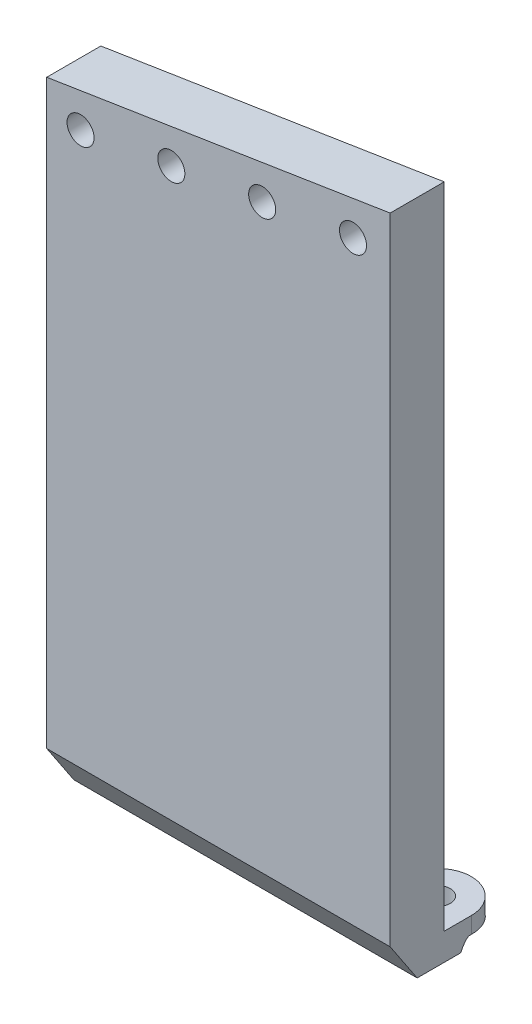
ISO-10303-21;
HEADER;
FILE_DESCRIPTION(('STEP AP214'),'2;1');
FILE_NAME('part.step','',(''),(''),'','','');
FILE_SCHEMA(('AUTOMOTIVE_DESIGN { 1 0 10303 214 1 1 1 1 }'));
ENDSEC;
DATA;
#1=APPLICATION_CONTEXT('core data for automotive mechanical design processes');
#2=APPLICATION_PROTOCOL_DEFINITION('international standard','automotive_design',2000,#1);
#3=PRODUCT_CONTEXT('',#1,'mechanical');
#4=PRODUCT('Part','Part','',(#3));
#5=PRODUCT_RELATED_PRODUCT_CATEGORY('part','',(#4));
#6=PRODUCT_DEFINITION_FORMATION('','',#4);
#7=PRODUCT_DEFINITION_CONTEXT('part definition',#1,'design');
#8=PRODUCT_DEFINITION('design','',#6,#7);
#9=PRODUCT_DEFINITION_SHAPE('','',#8);
#10=(LENGTH_UNIT() NAMED_UNIT(*) SI_UNIT(.MILLI.,.METRE.));
#11=(NAMED_UNIT(*) PLANE_ANGLE_UNIT() SI_UNIT($,.RADIAN.));
#12=(NAMED_UNIT(*) SI_UNIT($,.STERADIAN.) SOLID_ANGLE_UNIT());
#13=UNCERTAINTY_MEASURE_WITH_UNIT(LENGTH_MEASURE(1.E-05),#10,'distance_accuracy_value','');
#14=(GEOMETRIC_REPRESENTATION_CONTEXT(3) GLOBAL_UNCERTAINTY_ASSIGNED_CONTEXT((#13)) GLOBAL_UNIT_ASSIGNED_CONTEXT((#10,
#11,#12)) REPRESENTATION_CONTEXT('',''));
#15=CARTESIAN_POINT('',(0.,0.,0.));
#16=DIRECTION('',(0.,0.,1.));
#17=DIRECTION('',(1.,0.,0.));
#18=AXIS2_PLACEMENT_3D('',#15,#16,#17);
#19=CARTESIAN_POINT('',(3.175,2.54,-7.62));
#20=DIRECTION('',(0.,-1.,0.));
#21=DIRECTION('',(0.,0.,-1.));
#22=AXIS2_PLACEMENT_3D('',#19,#20,#21);
#23=PLANE('',#22);
#24=DIRECTION('',(-1.,0.,0.));
#25=VECTOR('',#24,1.);
#26=CARTESIAN_POINT('',(0.,2.54,-5.08));
#27=LINE('',#26,#25);
#28=CARTESIAN_POINT('',(32.258,2.54,-5.08));
#29=VERTEX_POINT('',#28);
#30=CARTESIAN_POINT('',(0.,2.54,-5.08));
#31=VERTEX_POINT('',#30);
#32=EDGE_CURVE('E11',#29,#31,#27,.T.);
#33=ORIENTED_EDGE('',*,*,#32,.F.);
#34=DIRECTION('',(0.,0.,-1.));
#35=VECTOR('',#34,1.);
#36=CARTESIAN_POINT('',(32.258,2.54,-7.62));
#37=LINE('',#36,#35);
#38=CARTESIAN_POINT('',(32.258,2.54,-7.62));
#39=VERTEX_POINT('',#38);
#40=EDGE_CURVE('E161',#29,#39,#37,.T.);
#41=ORIENTED_EDGE('',*,*,#40,.T.);
#42=CARTESIAN_POINT('',(29.083,2.54,-7.62));
#43=DIRECTION('',(0.,1.,0.));
#44=DIRECTION('',(0.,0.,1.));
#45=AXIS2_PLACEMENT_3D('',#42,#43,#44);
#46=CIRCLE('',#45,3.175);
#47=CARTESIAN_POINT('',(25.908,2.54,-7.62));
#48=VERTEX_POINT('',#47);
#49=EDGE_CURVE('E183',#39,#48,#46,.T.);
#50=ORIENTED_EDGE('',*,*,#49,.T.);
#51=DIRECTION('',(-1.,0.,0.));
#52=VECTOR('',#51,1.);
#53=CARTESIAN_POINT('',(6.35,2.54,-7.62));
#54=LINE('',#53,#52);
#55=CARTESIAN_POINT('',(6.35,2.54,-7.62));
#56=VERTEX_POINT('',#55);
#57=EDGE_CURVE('E578',#48,#56,#54,.T.);
#58=ORIENTED_EDGE('',*,*,#57,.T.);
#59=CARTESIAN_POINT('',(3.175,2.54,-7.62));
#60=DIRECTION('',(0.,1.,0.));
#61=DIRECTION('',(0.,0.,-1.));
#62=AXIS2_PLACEMENT_3D('',#59,#60,#61);
#63=CIRCLE('',#62,3.175);
#64=CARTESIAN_POINT('',(0.,2.54,-7.62));
#65=VERTEX_POINT('',#64);
#66=EDGE_CURVE('E579',#56,#65,#63,.T.);
#67=ORIENTED_EDGE('',*,*,#66,.T.);
#68=DIRECTION('',(0.,0.,1.));
#69=VECTOR('',#68,1.);
#70=CARTESIAN_POINT('',(0.,2.54,0.));
#71=LINE('',#70,#69);
#72=EDGE_CURVE('E186',#65,#31,#71,.T.);
#73=ORIENTED_EDGE('',*,*,#72,.T.);
#74=EDGE_LOOP('',(#33,#41,#50,#58,#67,#73));
#75=FACE_BOUND('',#74,.T.);
#76=CARTESIAN_POINT('',(29.083,2.54,-7.62));
#77=DIRECTION('',(0.,1.,0.));
#78=DIRECTION('',(0.,0.,1.));
#79=AXIS2_PLACEMENT_3D('',#76,#77,#78);
#80=CIRCLE('',#79,1.2065);
#81=CARTESIAN_POINT('',(29.083,2.54,-6.4135));
#82=VERTEX_POINT('',#81);
#83=EDGE_CURVE('E174',#82,#82,#80,.T.);
#84=ORIENTED_EDGE('',*,*,#83,.F.);
#85=EDGE_LOOP('',(#84));
#86=FACE_BOUND('',#85,.T.);
#87=CARTESIAN_POINT('',(3.175,2.54,-7.62));
#88=DIRECTION('',(0.,1.,0.));
#89=DIRECTION('',(0.,0.,1.));
#90=AXIS2_PLACEMENT_3D('',#87,#88,#89);
#91=CIRCLE('',#90,1.2065);
#92=CARTESIAN_POINT('',(3.175,2.54,-6.4135));
#93=VERTEX_POINT('',#92);
#94=EDGE_CURVE('E177',#93,#93,#91,.T.);
#95=ORIENTED_EDGE('',*,*,#94,.F.);
#96=EDGE_LOOP('',(#95));
#97=FACE_BOUND('',#96,.T.);
#98=ADVANCED_FACE('F32',(#75,#86,#97),#23,.F.);
#99=CARTESIAN_POINT('',(3.175,0.,-7.62));
#100=DIRECTION('',(0.,-1.,0.));
#101=DIRECTION('',(0.,0.,-1.));
#102=AXIS2_PLACEMENT_3D('',#99,#100,#101);
#103=PLANE('',#102);
#104=DIRECTION('',(0.,0.,-1.));
#105=VECTOR('',#104,1.);
#106=CARTESIAN_POINT('',(32.258,0.,-7.62));
#107=LINE('',#106,#105);
#108=CARTESIAN_POINT('',(32.258,0.,-2.54));
#109=VERTEX_POINT('',#108);
#110=CARTESIAN_POINT('',(32.258,0.,-6.6275294111197));
#111=VERTEX_POINT('',#110);
#112=EDGE_CURVE('E567',#109,#111,#107,.T.);
#113=ORIENTED_EDGE('',*,*,#112,.F.);
#114=DIRECTION('',(-1.,0.,0.));
#115=VECTOR('',#114,1.);
#116=CARTESIAN_POINT('',(36.8370501198393,0.,-2.54));
#117=LINE('',#116,#115);
#118=CARTESIAN_POINT('',(0.,0.,-2.54));
#119=VERTEX_POINT('',#118);
#120=EDGE_CURVE('E40',#109,#119,#117,.T.);
#121=ORIENTED_EDGE('',*,*,#120,.T.);
#122=DIRECTION('',(0.,0.,1.));
#123=VECTOR('',#122,1.);
#124=CARTESIAN_POINT('',(0.,0.,0.));
#125=LINE('',#124,#123);
#126=CARTESIAN_POINT('',(0.,0.,-7.61183733119424));
#127=VERTEX_POINT('',#126);
#128=EDGE_CURVE('E180',#127,#119,#125,.T.);
#129=ORIENTED_EDGE('',*,*,#128,.F.);
#130=CARTESIAN_POINT('',(3.25567860446436,0.,-7.61591866559716));
#131=DIRECTION('',(0.,-1.,0.));
#132=DIRECTION('',(-1.,0.,0.));
#133=AXIS2_PLACEMENT_3D('',#130,#131,#132);
#134=ELLIPSE('',#133,3.25568122609679,3.21604640238336);
#135=CARTESIAN_POINT('',(6.51135720892872,0.,-7.62));
#136=VERTEX_POINT('',#135);
#137=EDGE_CURVE('E311',#136,#127,#134,.T.);
#138=ORIENTED_EDGE('',*,*,#137,.F.);
#139=DIRECTION('',(-1.,0.,0.));
#140=VECTOR('',#139,1.);
#141=CARTESIAN_POINT('',(6.35,0.,-7.62));
#142=LINE('',#141,#140);
#143=CARTESIAN_POINT('',(25.908,0.,-7.62));
#144=VERTEX_POINT('',#143);
#145=EDGE_CURVE('E298',#144,#136,#142,.T.);
#146=ORIENTED_EDGE('',*,*,#145,.F.);
#147=CARTESIAN_POINT('',(29.1669458751256,0.,-7.64786729186757));
#148=DIRECTION('',(0.,-1.,0.));
#149=DIRECTION('',(-1.,0.,0.));
#150=AXIS2_PLACEMENT_3D('',#147,#148,#149);
#151=ELLIPSE('',#150,3.25906797448663,3.21939192033137);
#152=EDGE_CURVE('E327',#111,#144,#151,.T.);
#153=ORIENTED_EDGE('',*,*,#152,.F.);
#154=EDGE_LOOP('',(#113,#121,#129,#138,#146,#153));
#155=FACE_BOUND('',#154,.T.);
#156=ADVANCED_FACE('F276',(#155),#103,.T.);
#157=CARTESIAN_POINT('',(0.,2.54,0.));
#158=DIRECTION('',(0.,0.,-1.));
#159=DIRECTION('',(-1.,0.,0.));
#160=AXIS2_PLACEMENT_3D('',#157,#158,#159);
#161=PLANE('',#160);
#162=DIRECTION('',(-1.,0.,0.));
#163=VECTOR('',#162,1.);
#164=CARTESIAN_POINT('',(36.8370501198393,3.81,0.));
#165=LINE('',#164,#163);
#166=CARTESIAN_POINT('',(32.258,3.81,0.));
#167=VERTEX_POINT('',#166);
#168=CARTESIAN_POINT('',(0.,3.81,0.));
#169=VERTEX_POINT('',#168);
#170=EDGE_CURVE('E160',#167,#169,#165,.T.);
#171=ORIENTED_EDGE('',*,*,#170,.F.);
#172=DIRECTION('',(0.,1.,0.));
#173=VECTOR('',#172,1.);
#174=CARTESIAN_POINT('',(32.258,63.5,0.));
#175=LINE('',#174,#173);
#176=CARTESIAN_POINT('',(32.258,63.5,0.));
#177=VERTEX_POINT('',#176);
#178=EDGE_CURVE('E144',#167,#177,#175,.T.);
#179=ORIENTED_EDGE('',*,*,#178,.T.);
#180=DIRECTION('',(0.987825950711718,0.155563141844365,0.));
#181=VECTOR('',#180,1.);
#182=CARTESIAN_POINT('',(32.258,63.5,0.));
#183=LINE('',#182,#181);
#184=CARTESIAN_POINT('',(0.,58.42,0.));
#185=VERTEX_POINT('',#184);
#186=EDGE_CURVE('E159',#185,#177,#183,.T.);
#187=ORIENTED_EDGE('',*,*,#186,.F.);
#188=DIRECTION('',(0.,-1.,0.));
#189=VECTOR('',#188,1.);
#190=CARTESIAN_POINT('',(0.,2.54,0.));
#191=LINE('',#190,#189);
#192=EDGE_CURVE('E191',#185,#169,#191,.T.);
#193=ORIENTED_EDGE('',*,*,#192,.T.);
#194=EDGE_LOOP('',(#171,#179,#187,#193));
#195=FACE_BOUND('',#194,.T.);
#196=CARTESIAN_POINT('',(3.175,55.7058710355681,0.));
#197=DIRECTION('',(0.,0.,-1.));
#198=DIRECTION('',(-1.,0.,0.));
#199=AXIS2_PLACEMENT_3D('',#196,#197,#198);
#200=CIRCLE('',#199,1.27);
#201=CARTESIAN_POINT('',(1.905,55.7058710355681,0.));
#202=VERTEX_POINT('',#201);
#203=EDGE_CURVE('E336',#202,#202,#200,.F.);
#204=ORIENTED_EDGE('',*,*,#203,.F.);
#205=EDGE_LOOP('',(#204));
#206=FACE_BOUND('',#205,.T.);
#207=CARTESIAN_POINT('',(11.7058649103464,57.049314328536,0.));
#208=DIRECTION('',(0.,0.,-1.));
#209=DIRECTION('',(-1.,0.,0.));
#210=AXIS2_PLACEMENT_3D('',#207,#208,#209);
#211=CIRCLE('',#210,1.27);
#212=CARTESIAN_POINT('',(10.4358649103464,57.049314328536,0.));
#213=VERTEX_POINT('',#212);
#214=EDGE_CURVE('E342',#213,#213,#211,.F.);
#215=ORIENTED_EDGE('',*,*,#214,.F.);
#216=EDGE_LOOP('',(#215));
#217=FACE_BOUND('',#216,.T.);
#218=CARTESIAN_POINT('',(20.2367298206928,58.392757621504,0.));
#219=DIRECTION('',(0.,0.,-1.));
#220=DIRECTION('',(-1.,0.,0.));
#221=AXIS2_PLACEMENT_3D('',#218,#219,#220);
#222=CIRCLE('',#221,1.27);
#223=CARTESIAN_POINT('',(18.9667298206928,58.392757621504,0.));
#224=VERTEX_POINT('',#223);
#225=EDGE_CURVE('E348',#224,#224,#222,.F.);
#226=ORIENTED_EDGE('',*,*,#225,.F.);
#227=EDGE_LOOP('',(#226));
#228=FACE_BOUND('',#227,.T.);
#229=CARTESIAN_POINT('',(28.7675947310392,59.7362009144719,0.));
#230=DIRECTION('',(0.,0.,-1.));
#231=DIRECTION('',(-1.,0.,0.));
#232=AXIS2_PLACEMENT_3D('',#229,#230,#231);
#233=CIRCLE('',#232,1.27);
#234=CARTESIAN_POINT('',(27.4975947310392,59.7362009144719,0.));
#235=VERTEX_POINT('',#234);
#236=EDGE_CURVE('E166',#235,#235,#233,.F.);
#237=ORIENTED_EDGE('',*,*,#236,.F.);
#238=EDGE_LOOP('',(#237));
#239=FACE_BOUND('',#238,.T.);
#240=ADVANCED_FACE('F34',(#195,#206,#217,#228,#239),#161,.F.);
#241=CARTESIAN_POINT('',(0.,63.5,-5.08));
#242=DIRECTION('',(0.,0.,1.));
#243=DIRECTION('',(1.,0.,0.));
#244=AXIS2_PLACEMENT_3D('',#241,#242,#243);
#245=PLANE('',#244);
#246=DIRECTION('',(-0.987825950711718,-0.155563141844365,0.));
#247=VECTOR('',#246,1.);
#248=CARTESIAN_POINT('',(32.258,63.5,-5.08));
#249=LINE('',#248,#247);
#250=CARTESIAN_POINT('',(32.258,63.5,-5.08));
#251=VERTEX_POINT('',#250);
#252=CARTESIAN_POINT('',(0.,58.42,-5.08));
#253=VERTEX_POINT('',#252);
#254=EDGE_CURVE('E152',#251,#253,#249,.T.);
#255=ORIENTED_EDGE('',*,*,#254,.F.);
#256=DIRECTION('',(0.,-1.,0.));
#257=VECTOR('',#256,1.);
#258=CARTESIAN_POINT('',(32.258,63.5,-5.08));
#259=LINE('',#258,#257);
#260=EDGE_CURVE('E146',#251,#29,#259,.T.);
#261=ORIENTED_EDGE('',*,*,#260,.T.);
#262=ORIENTED_EDGE('',*,*,#32,.T.);
#263=DIRECTION('',(0.,-1.,0.));
#264=VECTOR('',#263,1.);
#265=CARTESIAN_POINT('',(0.,63.5,-5.08));
#266=LINE('',#265,#264);
#267=EDGE_CURVE('E151',#253,#31,#266,.T.);
#268=ORIENTED_EDGE('',*,*,#267,.F.);
#269=EDGE_LOOP('',(#255,#261,#262,#268));
#270=FACE_BOUND('',#269,.T.);
#271=CARTESIAN_POINT('',(3.175,55.7058710355681,-5.08));
#272=DIRECTION('',(0.,0.,-1.));
#273=DIRECTION('',(-1.,0.,0.));
#274=AXIS2_PLACEMENT_3D('',#271,#272,#273);
#275=CIRCLE('',#274,1.27);
#276=CARTESIAN_POINT('',(1.905,55.7058710355681,-5.08));
#277=VERTEX_POINT('',#276);
#278=EDGE_CURVE('E333',#277,#277,#275,.T.);
#279=ORIENTED_EDGE('',*,*,#278,.F.);
#280=EDGE_LOOP('',(#279));
#281=FACE_BOUND('',#280,.T.);
#282=CARTESIAN_POINT('',(11.7058649103464,57.049314328536,-5.08));
#283=DIRECTION('',(0.,0.,-1.));
#284=DIRECTION('',(-1.,0.,0.));
#285=AXIS2_PLACEMENT_3D('',#282,#283,#284);
#286=CIRCLE('',#285,1.27);
#287=CARTESIAN_POINT('',(10.4358649103464,57.049314328536,-5.08));
#288=VERTEX_POINT('',#287);
#289=EDGE_CURVE('E339',#288,#288,#286,.T.);
#290=ORIENTED_EDGE('',*,*,#289,.F.);
#291=EDGE_LOOP('',(#290));
#292=FACE_BOUND('',#291,.T.);
#293=CARTESIAN_POINT('',(20.2367298206928,58.392757621504,-5.08));
#294=DIRECTION('',(0.,0.,-1.));
#295=DIRECTION('',(-1.,0.,0.));
#296=AXIS2_PLACEMENT_3D('',#293,#294,#295);
#297=CIRCLE('',#296,1.27);
#298=CARTESIAN_POINT('',(18.9667298206928,58.392757621504,-5.08));
#299=VERTEX_POINT('',#298);
#300=EDGE_CURVE('E345',#299,#299,#297,.T.);
#301=ORIENTED_EDGE('',*,*,#300,.F.);
#302=EDGE_LOOP('',(#301));
#303=FACE_BOUND('',#302,.T.);
#304=CARTESIAN_POINT('',(28.7675947310392,59.7362009144719,-5.08));
#305=DIRECTION('',(0.,0.,-1.));
#306=DIRECTION('',(-1.,0.,0.));
#307=AXIS2_PLACEMENT_3D('',#304,#305,#306);
#308=CIRCLE('',#307,1.27);
#309=CARTESIAN_POINT('',(27.4975947310392,59.7362009144719,-5.08));
#310=VERTEX_POINT('',#309);
#311=EDGE_CURVE('E170',#310,#310,#308,.T.);
#312=ORIENTED_EDGE('',*,*,#311,.F.);
#313=EDGE_LOOP('',(#312));
#314=FACE_BOUND('',#313,.T.);
#315=ADVANCED_FACE('F271',(#270,#281,#292,#303,#314),#245,.F.);
#316=CARTESIAN_POINT('',(36.8370501198393,0.,-2.54));
#317=DIRECTION('',(0.,0.554700196225229,-0.832050294337844));
#318=DIRECTION('',(0.,0.832050294337844,0.554700196225229));
#319=AXIS2_PLACEMENT_3D('',#316,#317,#318);
#320=PLANE('',#319);
#321=ORIENTED_EDGE('',*,*,#120,.F.);
#322=DIRECTION('',(0.,0.832050294337844,0.554700196225229));
#323=VECTOR('',#322,1.);
#324=CARTESIAN_POINT('',(32.258,0.,-2.54));
#325=LINE('',#324,#323);
#326=EDGE_CURVE('E569',#109,#167,#325,.T.);
#327=ORIENTED_EDGE('',*,*,#326,.T.);
#328=ORIENTED_EDGE('',*,*,#170,.T.);
#329=DIRECTION('',(0.,-0.832050294337844,-0.554700196225229));
#330=VECTOR('',#329,1.);
#331=CARTESIAN_POINT('',(0.,0.,-2.54));
#332=LINE('',#331,#330);
#333=EDGE_CURVE('E330',#169,#119,#332,.T.);
#334=ORIENTED_EDGE('',*,*,#333,.T.);
#335=EDGE_LOOP('',(#321,#327,#328,#334));
#336=FACE_BOUND('',#335,.T.);
#337=ADVANCED_FACE('F262',(#336),#320,.F.);
#338=CARTESIAN_POINT('',(3.175,0.,-7.62));
#339=DIRECTION('',(0.,-1.,0.));
#340=DIRECTION('',(0.,0.,-1.));
#341=AXIS2_PLACEMENT_3D('',#338,#339,#340);
#342=PLANE('',#341);
#343=CARTESIAN_POINT('',(2.24958940364672E-11,3.54360638055162E-12,-7.62000003545597));
#344=VERTEX_POINT('',#343);
#345=CARTESIAN_POINT('',(0.758337824352487,0.,-9.67921280863444));
#346=VERTEX_POINT('',#345);
#347=EDGE_CURVE('E314',#344,#346,#134,.T.);
#348=ORIENTED_EDGE('',*,*,#347,.F.);
#349=CARTESIAN_POINT('',(3.175,0.,-7.62));
#350=DIRECTION('',(0.,1.,0.));
#351=DIRECTION('',(0.,0.,-1.));
#352=AXIS2_PLACEMENT_3D('',#349,#350,#351);
#353=CIRCLE('',#352,3.175);
#354=EDGE_CURVE('E306',#346,#344,#353,.T.);
#355=ORIENTED_EDGE('',*,*,#354,.F.);
#356=EDGE_LOOP('',(#348,#355));
#357=FACE_BOUND('',#356,.T.);
#358=ADVANCED_FACE('F259',(#357),#342,.T.);
#359=CARTESIAN_POINT('',(0.,2.54,0.));
#360=DIRECTION('',(1.,0.,0.));
#361=DIRECTION('',(0.,0.,-1.));
#362=AXIS2_PLACEMENT_3D('',#359,#360,#361);
#363=PLANE('',#362);
#364=CARTESIAN_POINT('',(0.,0.,-7.61591866559716));
#365=VERTEX_POINT('',#364);
#366=EDGE_CURVE('E307',#344,#365,#125,.T.);
#367=ORIENTED_EDGE('',*,*,#366,.T.);
#368=CARTESIAN_POINT('',(3.17689153677812,0.500297879807579,-7.61591866559716));
#369=DIRECTION('',(-0.155563141844365,0.987825950711718,0.));
#370=DIRECTION('',(-0.987825950711718,-0.155563141844365,0.));
#371=AXIS2_PLACEMENT_3D('',#368,#369,#370);
#372=CIRCLE('',#371,3.21604640238336);
#373=EDGE_CURVE('E204',#365,#127,#372,.T.);
#374=ORIENTED_EDGE('',*,*,#373,.T.);
#375=ORIENTED_EDGE('',*,*,#128,.T.);
#376=ORIENTED_EDGE('',*,*,#333,.F.);
#377=ORIENTED_EDGE('',*,*,#192,.F.);
#378=DIRECTION('',(0.,0.,1.));
#379=VECTOR('',#378,1.);
#380=CARTESIAN_POINT('',(0.,58.42,-37.735550278628));
#381=LINE('',#380,#379);
#382=EDGE_CURVE('E164',#253,#185,#381,.T.);
#383=ORIENTED_EDGE('',*,*,#382,.F.);
#384=ORIENTED_EDGE('',*,*,#267,.T.);
#385=ORIENTED_EDGE('',*,*,#72,.F.);
#386=DIRECTION('',(0.,-1.,0.));
#387=VECTOR('',#386,1.);
#388=CARTESIAN_POINT('',(0.,2.54,-7.62));
#389=LINE('',#388,#387);
#390=EDGE_CURVE('E56',#65,#344,#389,.T.);
#391=ORIENTED_EDGE('',*,*,#390,.T.);
#392=EDGE_LOOP('',(#367,#374,#375,#376,#377,#383,#384,#385,#391));
#393=FACE_BOUND('',#392,.T.);
#394=ADVANCED_FACE('F261',(#393),#363,.F.);
#395=CARTESIAN_POINT('',(29.083,2.54,-7.62));
#396=DIRECTION('',(0.,-1.,0.));
#397=DIRECTION('',(0.,0.,-1.));
#398=AXIS2_PLACEMENT_3D('',#395,#396,#397);
#399=CYLINDRICAL_SURFACE('',#398,3.175);
#400=DIRECTION('',(0.,-1.,0.));
#401=VECTOR('',#400,1.);
#402=CARTESIAN_POINT('',(32.258,2.54,-7.62));
#403=LINE('',#402,#401);
#404=CARTESIAN_POINT('',(32.258,0.999999999999999,-7.62));
#405=VERTEX_POINT('',#404);
#406=EDGE_CURVE('E577',#39,#405,#403,.T.);
#407=ORIENTED_EDGE('',*,*,#406,.T.);
#408=CARTESIAN_POINT('',(29.083,0.499999999999999,-7.62));
#409=DIRECTION('',(-0.155563141844365,0.987825950711718,0.));
#410=DIRECTION('',(-0.987825950711718,-0.155563141844365,0.));
#411=AXIS2_PLACEMENT_3D('',#408,#409,#410);
#412=ELLIPSE('',#411,3.21412896443189,3.175);
#413=EDGE_CURVE('E199',#405,#144,#412,.T.);
#414=ORIENTED_EDGE('',*,*,#413,.T.);
#415=DIRECTION('',(0.,-1.,0.));
#416=VECTOR('',#415,1.);
#417=CARTESIAN_POINT('',(25.908,2.54,-7.62));
#418=LINE('',#417,#416);
#419=EDGE_CURVE('E303',#48,#144,#418,.T.);
#420=ORIENTED_EDGE('',*,*,#419,.F.);
#421=ORIENTED_EDGE('',*,*,#49,.F.);
#422=EDGE_LOOP('',(#407,#414,#420,#421));
#423=FACE_BOUND('',#422,.T.);
#424=ADVANCED_FACE('F267',(#423),#399,.T.);
#425=CARTESIAN_POINT('',(6.35,2.54,-7.62));
#426=DIRECTION('',(0.,0.,1.));
#427=DIRECTION('',(1.,0.,0.));
#428=AXIS2_PLACEMENT_3D('',#425,#426,#427);
#429=PLANE('',#428);
#430=ORIENTED_EDGE('',*,*,#145,.T.);
#431=DIRECTION('',(-0.155563141844365,0.987825950711718,0.));
#432=VECTOR('',#431,1.);
#433=CARTESIAN_POINT('',(6.74891345384093,-1.50848215519261,-7.62));
#434=LINE('',#433,#432);
#435=CARTESIAN_POINT('',(6.35378307355625,1.00059575961516,-7.62));
#436=VERTEX_POINT('',#435);
#437=EDGE_CURVE('E301',#136,#436,#434,.T.);
#438=ORIENTED_EDGE('',*,*,#437,.T.);
#439=DIRECTION('',(-0.987825950711718,-0.155563141844365,0.));
#440=VECTOR('',#439,1.);
#441=CARTESIAN_POINT('',(6.58665073507169,1.03726783229475,-7.62));
#442=LINE('',#441,#440);
#443=CARTESIAN_POINT('',(6.35,1.,-7.62));
#444=VERTEX_POINT('',#443);
#445=EDGE_CURVE('E317',#436,#444,#442,.T.);
#446=ORIENTED_EDGE('',*,*,#445,.T.);
#447=DIRECTION('',(0.,-1.,0.));
#448=VECTOR('',#447,1.);
#449=CARTESIAN_POINT('',(6.35,2.54,-7.62));
#450=LINE('',#449,#448);
#451=EDGE_CURVE('E560',#56,#444,#450,.T.);
#452=ORIENTED_EDGE('',*,*,#451,.F.);
#453=ORIENTED_EDGE('',*,*,#57,.F.);
#454=ORIENTED_EDGE('',*,*,#419,.T.);
#455=EDGE_LOOP('',(#430,#438,#446,#452,#453,#454));
#456=FACE_BOUND('',#455,.T.);
#457=ADVANCED_FACE('F288',(#456),#429,.F.);
#458=CARTESIAN_POINT('',(3.175,2.54,-7.62));
#459=DIRECTION('',(0.,-1.,0.));
#460=DIRECTION('',(0.,0.,-1.));
#461=AXIS2_PLACEMENT_3D('',#458,#459,#460);
#462=CYLINDRICAL_SURFACE('',#461,3.175);
#463=CARTESIAN_POINT('',(3.175,0.5,-7.62));
#464=DIRECTION('',(-0.155563141844365,0.987825950711718,0.));
#465=DIRECTION('',(-0.987825950711718,-0.155563141844365,0.));
#466=AXIS2_PLACEMENT_3D('',#463,#464,#465);
#467=ELLIPSE('',#466,3.21412896443189,3.175);
#468=CARTESIAN_POINT('',(0.0162900762634005,0.00256536634069405,-7.94121117282106));
#469=VERTEX_POINT('',#468);
#470=EDGE_CURVE('E203',#444,#469,#467,.T.);
#471=ORIENTED_EDGE('',*,*,#470,.T.);
#472=CARTESIAN_POINT('',(0.758364095851879,2.89927095979127E-05,-9.67924644148829));
#473=CARTESIAN_POINT('',(0.851662085906556,-0.00372406969738923,-9.78873746370257));
#474=CARTESIAN_POINT('',(0.952390017478117,-0.0091325103089678,-9.89184688291844));
#475=CARTESIAN_POINT('',(1.1667326154183,-0.0259617995329412,-10.0833592044665));
#476=CARTESIAN_POINT('',(1.28035631092382,-0.0373868814029539,-10.1717516943864));
#477=CARTESIAN_POINT('',(1.49181754731522,-0.0678965925123329,-10.3144498619984));
#478=CARTESIAN_POINT('',(1.5877579714501,-0.0847915562185713,-10.371993547465));
#479=CARTESIAN_POINT('',(1.73404740093397,-0.119030412548098,-10.4497239724649));
#480=CARTESIAN_POINT('',(1.78317319297256,-0.131914458112012,-10.4741896966866));
#481=CARTESIAN_POINT('',(1.88163930772153,-0.161538636388509,-10.520136336627));
#482=CARTESIAN_POINT('',(1.930979484588,-0.178276458738003,-10.5416190283714));
#483=CARTESIAN_POINT('',(2.04341464851695,-0.222232080409762,-10.5872880240732));
#484=CARTESIAN_POINT('',(2.10632309769565,-0.251082710777737,-10.6104346964456));
#485=CARTESIAN_POINT('',(2.2282486386354,-0.318876641761765,-10.6512385718857));
#486=CARTESIAN_POINT('',(2.28727681407396,-0.357789475455508,-10.6689119981672));
#487=CARTESIAN_POINT('',(2.3986921656803,-0.44638237598379,-10.6991791481844));
#488=CARTESIAN_POINT('',(2.45104281189826,-0.496117952095346,-10.7117456889912));
#489=CARTESIAN_POINT('',(2.54700715216324,-0.604196311228425,-10.7326665481305));
#490=CARTESIAN_POINT('',(2.59060445706645,-0.662554891323599,-10.7410130086151));
#491=CARTESIAN_POINT('',(2.66123841202872,-0.771927318194827,-10.7533155952061));
#492=CARTESIAN_POINT('',(2.68983031617554,-0.821911495463157,-10.757825532643));
#493=CARTESIAN_POINT('',(2.74272426547257,-0.92421994665483,-10.7655488729967));
#494=CARTESIAN_POINT('',(2.76702280551354,-0.976546089286318,-10.7687612192843));
#495=CARTESIAN_POINT('',(2.81226110764172,-1.08296618198036,-10.7742933352141));
#496=CARTESIAN_POINT('',(2.83318300707982,-1.13706782132742,-10.7766084432829));
#497=CARTESIAN_POINT('',(2.87224620439934,-1.24624913511607,-10.7805925589771));
#498=CARTESIAN_POINT('',(2.89038866942758,-1.3013283881337,-10.782261838252));
#499=CARTESIAN_POINT('',(2.94750790716508,-1.48670876381068,-10.787100064996));
#500=CARTESIAN_POINT('',(2.98167110642153,-1.618503013938,-10.7892646361707));
#501=CARTESIAN_POINT('',(3.04317994603956,-1.88371237364424,-10.7924053393302));
#502=CARTESIAN_POINT('',(3.07051868496592,-2.01712898208005,-10.7933802721002));
#503=CARTESIAN_POINT('',(3.12095161760057,-2.28513382373777,-10.7946405489373));
#504=CARTESIAN_POINT('',(3.14403407178113,-2.41972425590769,-10.7949240113595));
#505=CARTESIAN_POINT('',(3.18731568770326,-2.68929539698824,-10.7950486013621));
#506=CARTESIAN_POINT('',(3.20751610986837,-2.82427590878761,-10.794889922935));
#507=CARTESIAN_POINT('',(3.26531771582277,-3.23046365685446,-10.7939532272941));
#508=CARTESIAN_POINT('',(3.2999761779417,-3.50208460416694,-10.7927126876083));
#509=CARTESIAN_POINT('',(3.36510638001729,-4.04534185528972,-10.7894654162493));
#510=CARTESIAN_POINT('',(3.39558499768902,-4.31697737988086,-10.7874599642742));
#511=CARTESIAN_POINT('',(3.48273779129497,-5.12615105468619,-10.7805927359066));
#512=CARTESIAN_POINT('',(3.53589543147073,-5.66405811661804,-10.7748551301668));
#513=CARTESIAN_POINT('',(3.63819568310774,-6.74023826701895,-10.7614432925594));
#514=CARTESIAN_POINT('',(3.68733809849976,-7.27851137206983,-10.7537689661937));
#515=CARTESIAN_POINT('',(3.78342973886248,-8.35561392985555,-10.7365413834557));
#516=CARTESIAN_POINT('',(3.83037736575243,-8.89444350474285,-10.7269867835886));
#517=CARTESIAN_POINT('',(3.92297019667448,-9.97216590283745,-10.7060024477393));
#518=CARTESIAN_POINT('',(3.96861542652872,-10.5110587245778,-10.6945727489643));
#519=CARTESIAN_POINT('',(4.05896715241364,-11.587712747068,-10.6698224618309));
#520=CARTESIAN_POINT('',(4.10367545536722,-12.1254738903452,-10.656505990779));
#521=CARTESIAN_POINT('',(4.19252151564509,-13.2009932265234,-10.6278978144394));
#522=CARTESIAN_POINT('',(4.23665926994691,-13.7387514193936,-10.6126060986927));
#523=CARTESIAN_POINT('',(4.36845244860398,-15.3517258357082,-10.563654202985));
#524=CARTESIAN_POINT('',(4.45550922654152,-16.4268996110527,-10.5269114246532));
#525=CARTESIAN_POINT('',(4.62895909527986,-18.5797852660351,-10.4441602935972));
#526=CARTESIAN_POINT('',(4.71534985041276,-19.6574964172529,-10.3981279236451));
#527=CARTESIAN_POINT('',(4.88756232165603,-21.8126083849966,-10.2954087638533));
#528=CARTESIAN_POINT('',(4.97338395869616,-22.8900091392992,-10.2387205243722));
#529=CARTESIAN_POINT('',(5.144337417176,-25.0406312093892,-10.1127152244595));
#530=CARTESIAN_POINT('',(5.229470571299,-26.1138547854272,-10.0434395415013));
#531=CARTESIAN_POINT('',(5.35690278313942,-27.7226811570352,-9.92720607629773));
#532=CARTESIAN_POINT('',(5.39933020874086,-28.2587201765412,-9.88641424965334));
#533=CARTESIAN_POINT('',(5.4841006960924,-29.3304120173968,-9.79998926755927));
#534=CARTESIAN_POINT('',(5.52644375866727,-29.866064842489,-9.75435615967913));
#535=CARTESIAN_POINT('',(5.61088979854599,-30.9349199121107,-9.65744649840696));
#536=CARTESIAN_POINT('',(5.65299309047368,-31.4681240168414,-9.60619093659847));
#537=CARTESIAN_POINT('',(5.7371278948837,-32.5341393062651,-9.49640928287147));
#538=CARTESIAN_POINT('',(5.77915934446761,-33.0669500235348,-9.43787857521351));
#539=CARTESIAN_POINT('',(5.86359223740968,-34.1377323573487,-9.31058019564987));
#540=CARTESIAN_POINT('',(5.90599223019913,-34.6756911125101,-9.24170039166783));
#541=CARTESIAN_POINT('',(5.969408964746,-35.4806455856864,-9.12789861730729));
#542=CARTESIAN_POINT('',(5.99049741352746,-35.7483800675967,-9.08826024004254));
#543=CARTESIAN_POINT('',(6.03260905528607,-36.283135430878,-9.00452138359104));
#544=CARTESIAN_POINT('',(6.05363225389698,-36.5501563735635,-8.96042130133982));
#545=CARTESIAN_POINT('',(6.09578064854343,-37.085614195769,-8.86594886338997));
#546=CARTESIAN_POINT('',(6.11690503963953,-37.3540419442099,-8.8155232346077));
#547=CARTESIAN_POINT('',(6.14853905476805,-37.7561185961506,-8.73334937452962));
#548=CARTESIAN_POINT('',(6.15910342782405,-37.8904119485208,-8.70478276851013));
#549=CARTESIAN_POINT('',(6.18017734735714,-38.1583402852732,-8.64496029458419));
#550=CARTESIAN_POINT('',(6.19068691720825,-38.2919755487023,-8.6137056932637));
#551=CARTESIAN_POINT('',(6.21146580510878,-38.5562351906992,-8.54825882083873));
#552=CARTESIAN_POINT('',(6.22173624947926,-38.6868731740613,-8.51412264076129));
#553=CARTESIAN_POINT('',(6.24219130772286,-38.9471102881815,-8.44121692492221));
#554=CARTESIAN_POINT('',(6.25237574003397,-39.0767072020308,-8.40243938883665));
#555=CARTESIAN_POINT('',(6.27248737183347,-39.3326981143498,-8.31862944576921));
#556=CARTESIAN_POINT('',(6.28241605625296,-39.4591103801435,-8.27365598695889));
#557=CARTESIAN_POINT('',(6.29703167294532,-39.6452801016433,-8.19808337286981));
#558=CARTESIAN_POINT('',(6.30185079835251,-39.7066788716918,-8.17158290566912));
#559=CARTESIAN_POINT('',(6.31134536315463,-39.8276851677336,-8.11477927380279));
#560=CARTESIAN_POINT('',(6.31602094946385,-39.8872945237305,-8.08448017040565));
#561=CARTESIAN_POINT('',(6.32235282700652,-39.9680631438299,-8.03828771299396));
#562=CARTESIAN_POINT('',(6.32411830658848,-39.9905882833034,-8.02482055354105));
#563=CARTESIAN_POINT('',(6.32759481009636,-40.0349563125766,-7.99678791162125));
#564=CARTESIAN_POINT('',(6.32930579002992,-40.0567986509642,-7.9822215723196));
#565=CARTESIAN_POINT('',(6.33431119737279,-40.1207211950961,-7.93674024467663));
#566=CARTESIAN_POINT('',(6.33750593981101,-40.1615520675718,-7.90384994035673));
#567=CARTESIAN_POINT('',(6.34145335128626,-40.2120842648953,-7.85319759058481));
#568=CARTESIAN_POINT('',(6.34247917682372,-40.2252253544215,-7.83891491322855));
#569=CARTESIAN_POINT('',(6.34440695667188,-40.2499459729015,-7.80897495184851));
#570=CARTESIAN_POINT('',(6.34530866611165,-40.2615224141415,-7.79331504762047));
#571=CARTESIAN_POINT('',(6.34694307338442,-40.282543346378,-7.76028168892209));
#572=CARTESIAN_POINT('',(6.3476733430566,-40.2919571716835,-7.74288807476331));
#573=CARTESIAN_POINT('',(6.34886796840187,-40.3074202570172,-7.70666719468114));
#574=CARTESIAN_POINT('',(6.34933334818265,-40.3134824722738,-7.68784577340355));
#575=CARTESIAN_POINT('',(6.34984367656352,-40.3202337133474,-7.65451445494531));
#576=CARTESIAN_POINT('',(6.34996815847899,-40.3219308581956,-7.64021056238196));
#577=CARTESIAN_POINT('',(6.35002100520915,-40.3228358604141,-7.61152064325131));
#578=CARTESIAN_POINT('',(6.34994939572323,-40.3220440439813,-7.59713462769348));
#579=CARTESIAN_POINT('',(6.34961815887744,-40.3180701244059,-7.56875823117132));
#580=CARTESIAN_POINT('',(6.34935916077936,-40.3148960197954,-7.55476668850429));
#581=CARTESIAN_POINT('',(6.34867963801938,-40.3064919248746,-7.52742516917243));
#582=CARTESIAN_POINT('',(6.34825897508194,-40.301260174524,-7.5140757527607));
#583=CARTESIAN_POINT('',(6.34699098795206,-40.285438355737,-7.48022781138923));
#584=CARTESIAN_POINT('',(6.34604011589333,-40.2735286600187,-7.46035522967183));
#585=CARTESIAN_POINT('',(6.34391592716347,-40.2468691686271,-7.42263304951006));
#586=CARTESIAN_POINT('',(6.34274189391935,-40.232110221522,-7.40479027221175));
#587=CARTESIAN_POINT('',(6.33840625211259,-40.1775526247605,-7.34558071161731));
#588=CARTESIAN_POINT('',(6.33488154255221,-40.1331098072761,-7.30861712784979));
#589=CARTESIAN_POINT('',(6.32747851604912,-40.0396875414159,-7.24101337251747));
#590=CARTESIAN_POINT('',(6.32359799220031,-39.9906797446089,-7.21041713723421));
#591=CARTESIAN_POINT('',(6.31221118883291,-39.8468145521408,-7.12859716534342));
#592=CARTESIAN_POINT('',(6.30448063060089,-39.7490732342085,-7.08251231313483));
#593=CARTESIAN_POINT('',(6.28876382859473,-39.5502970900297,-6.99800581764495));
#594=CARTESIAN_POINT('',(6.28077691323314,-39.4492535978045,-6.95960660162629));
#595=CARTESIAN_POINT('',(6.2646477546095,-39.245168786542,-6.8878370391907));
#596=CARTESIAN_POINT('',(6.2565052298001,-39.1421238393511,-6.85447702356636));
#597=CARTESIAN_POINT('',(6.24014890088138,-38.9351142000852,-6.79142666922391));
#598=CARTESIAN_POINT('',(6.23193521711746,-38.8311510566326,-6.76173108448069));
#599=CARTESIAN_POINT('',(6.20738749961285,-38.5204298905459,-6.677291691232));
#600=CARTESIAN_POINT('',(6.19097109735007,-38.3126164964712,-6.62646686303209));
#601=CARTESIAN_POINT('',(6.1580166857576,-37.8954524864073,-6.53155197634282));
#602=CARTESIAN_POINT('',(6.14147864132747,-37.6861014267439,-6.48746394865897));
#603=CARTESIAN_POINT('',(6.10830219855426,-37.2661499976039,-6.40411401785131));
#604=CARTESIAN_POINT('',(6.0916636928275,-37.0555482979773,-6.36485889412048));
#605=CARTESIAN_POINT('',(6.05833479121205,-36.6337220379944,-6.29008451175196));
#606=CARTESIAN_POINT('',(6.04164440219644,-36.4224975603151,-6.25456477831836));
#607=CARTESIAN_POINT('',(6.00825063850803,-35.9999275886251,-6.18656106693781));
#608=CARTESIAN_POINT('',(5.99154733191748,-35.7885828839724,-6.1540721247792));
#609=CARTESIAN_POINT('',(5.9581079539292,-35.3655298294331,-6.09153967614773));
#610=CARTESIAN_POINT('',(5.94137188154309,-35.1538214686012,-6.06149624464461));
#611=CARTESIAN_POINT('',(5.9078854743678,-34.7302819952398,-6.00349689955711));
#612=CARTESIAN_POINT('',(5.8911351593537,-34.5184510901062,-5.97553945472034));
#613=CARTESIAN_POINT('',(5.85761192990872,-34.0945673399307,-5.92140358008275));
#614=CARTESIAN_POINT('',(5.84083901574185,-33.8825144974879,-5.89522512968026));
#615=CARTESIAN_POINT('',(5.79058555958991,-33.2472859834279,-5.81915677048549));
#616=CARTESIAN_POINT('',(5.75707509971574,-32.8238361033359,-5.77157181440899));
#617=CARTESIAN_POINT('',(5.68998739088647,-31.9764183567992,-5.68128493728877));
#618=CARTESIAN_POINT('',(5.6564101404808,-31.5524504791832,-5.63858312350412));
#619=CARTESIAN_POINT('',(5.58919318978534,-30.7041028971268,-5.55721509706418));
#620=CARTESIAN_POINT('',(5.55555348515107,-30.2797231650978,-5.51854917674875));
#621=CARTESIAN_POINT('',(5.48821625498555,-29.430668491993,-5.44464995944392));
#622=CARTESIAN_POINT('',(5.45451872904427,-29.0059935488367,-5.40941668690017));
#623=CARTESIAN_POINT('',(5.35330320274311,-27.7311644873095,-5.30812378665187));
#624=CARTESIAN_POINT('',(5.28569842041506,-26.8806627292202,-5.24651377144186));
#625=CARTESIAN_POINT('',(5.15023409340237,-25.1790995060808,-5.13265754211732));
#626=CARTESIAN_POINT('',(5.08237455915341,-24.3280380651108,-5.08041094862086));
#627=CARTESIAN_POINT('',(4.94632442375982,-22.6253591214359,-4.98371484550469));
#628=CARTESIAN_POINT('',(4.87813376964844,-21.7737415499836,-4.93926662859079));
#629=CARTESIAN_POINT('',(4.7413263463365,-20.0702094442048,-4.85710126057886));
#630=CARTESIAN_POINT('',(4.67270957259277,-19.2182949068039,-4.81938418137416));
#631=CARTESIAN_POINT('',(4.53488586346785,-17.5144611548808,-4.74993258598704));
#632=CARTESIAN_POINT('',(4.46567906195161,-16.6625419830546,-4.71819674865508));
#633=CARTESIAN_POINT('',(4.32635490167936,-14.9585984260545,-4.66015074279529));
#634=CARTESIAN_POINT('',(4.25623754801837,-14.1065740414957,-4.63384054392211));
#635=CARTESIAN_POINT('',(4.14233875891023,-12.7373387245627,-4.5956099756776));
#636=CARTESIAN_POINT('',(4.0990361203155,-12.2201317796432,-4.58209782493994));
#637=CARTESIAN_POINT('',(4.01162394580342,-11.1857268384717,-4.55687142961147));
#638=CARTESIAN_POINT('',(3.96751438641691,-10.6685288429194,-4.54515723740734));
#639=CARTESIAN_POINT('',(3.87810592199338,-9.63427349337247,-4.52348797681575));
#640=CARTESIAN_POINT('',(3.83280718969063,-9.11721612985401,-4.51353265454844));
#641=CARTESIAN_POINT('',(3.74029096535401,-8.08325108627391,-4.49537346851411));
#642=CARTESIAN_POINT('',(3.69307350575707,-7.56634340383053,-4.48716957515307));
#643=CARTESIAN_POINT('',(3.59427191156769,-6.5209299038098,-4.47239361219051));
#644=CARTESIAN_POINT('',(3.54261238257611,-5.99243043486635,-4.46586335850783));
#645=CARTESIAN_POINT('',(3.45988680847003,-5.20018116886018,-4.45768723028465));
#646=CARTESIAN_POINT('',(3.43143754417199,-4.93616986121098,-4.45523165757526));
#647=CARTESIAN_POINT('',(3.37179139531187,-4.40846480693362,-4.45096352001324));
#648=CARTESIAN_POINT('',(3.34059464312246,-4.14477104562605,-4.44915092420341));
#649=CARTESIAN_POINT('',(3.27159474699729,-3.60030288677887,-4.44626346877766));
#650=CARTESIAN_POINT('',(3.23348943722697,-3.31956466111267,-4.44524600481437));
#651=CARTESIAN_POINT('',(3.16919509810428,-2.89949358303597,-4.44493468076776));
#652=CARTESIAN_POINT('',(3.14657113087805,-2.75962597509249,-4.4450334690273));
#653=CARTESIAN_POINT('',(3.09779443384287,-2.48053238573215,-4.44584522434213));
#654=CARTESIAN_POINT('',(3.07164230562661,-2.34130629910472,-4.44655808680195));
#655=CARTESIAN_POINT('',(3.01036187554382,-2.04600310542265,-4.449097818989));
#656=CARTESIAN_POINT('',(2.9745110668216,-1.89006718251131,-4.45105644038253));
#657=CARTESIAN_POINT('',(2.91205600069461,-1.65845642477854,-4.45584035862779));
#658=CARTESIAN_POINT('',(2.88978306710263,-1.58161198379058,-4.45774352305843));
#659=CARTESIAN_POINT('',(2.84130717339428,-1.42921699693184,-4.46248981140808));
#660=CARTESIAN_POINT('',(2.81510578916796,-1.35366594569956,-4.46533255896349));
#661=CARTESIAN_POINT('',(2.75084803028878,-1.18758294568922,-4.47325298640494));
#662=CARTESIAN_POINT('',(2.7114507988071,-1.09756828861877,-4.47869271764813));
#663=CARTESIAN_POINT('',(2.62146534938073,-0.923675444642389,-4.49329002541223));
#664=CARTESIAN_POINT('',(2.57091294062677,-0.839778739905485,-4.50243578207956));
#665=CARTESIAN_POINT('',(2.46814234180766,-0.699741281563082,-4.52434443251292));
#666=CARTESIAN_POINT('',(2.41859004824132,-0.64150090521673,-4.53591625574748));
#667=CARTESIAN_POINT('',(2.31130812361457,-0.534630921724429,-4.56423275895285));
#668=CARTESIAN_POINT('',(2.25358797958628,-0.485990319145311,-4.58097146382222));
#669=CARTESIAN_POINT('',(2.13266848186895,-0.39956850683914,-4.62030255792913));
#670=CARTESIAN_POINT('',(2.0694855849595,-0.361756065435063,-4.64287774715187));
#671=CARTESIAN_POINT('',(1.94051136896597,-0.295646887612724,-4.69399716431536));
#672=CARTESIAN_POINT('',(1.87471399637696,-0.267373869513633,-4.72255598829541));
#673=CARTESIAN_POINT('',(1.75391881539588,-0.222412038029412,-4.7801275892174));
#674=CARTESIAN_POINT('',(1.69892503061318,-0.204582685585281,-4.80829282880136));
#675=CARTESIAN_POINT('',(1.58978605756487,-0.17301883204794,-4.86834396090901));
#676=CARTESIAN_POINT('',(1.53564141758811,-0.159286881193615,-4.90023215350872));
#677=CARTESIAN_POINT('',(1.37528693701615,-0.122699192510205,-5.00129945623437));
#678=CARTESIAN_POINT('',(1.27131644886439,-0.104503750079517,-5.0758059097077));
#679=CARTESIAN_POINT('',(1.10559052042581,-0.0801754541149075,-5.21053058530624));
#680=CARTESIAN_POINT('',(1.04125059932801,-0.0720433962327534,-5.26731838441434));
#681=CARTESIAN_POINT('',(0.917228807670271,-0.0581014258863643,-5.38606555581442));
#682=CARTESIAN_POINT('',(0.857548255834769,-0.0522921689324771,-5.44802638201524));
#683=CARTESIAN_POINT('',(0.68635156507383,-0.0372901157884735,-5.64092317922494));
#684=CARTESIAN_POINT('',(0.582514163631602,-0.0305027563746855,-5.77900864886758));
#685=CARTESIAN_POINT('',(0.398064141929485,-0.0200723116393215,-6.07103379983043));
#686=CARTESIAN_POINT('',(0.317590287355182,-0.0164477664819804,-6.22506112215963));
#687=CARTESIAN_POINT('',(0.182795762789112,-0.0107054802859157,-6.54420687349756));
#688=CARTESIAN_POINT('',(0.128475437995728,-0.00858775913546741,-6.70932544886608));
#689=CARTESIAN_POINT('',(0.0463157699795005,-0.00487226942681956,-7.05103914802634));
#690=CARTESIAN_POINT('',(0.0192772300544319,-0.00329108239103107,-7.22782737291329));
#691=CARTESIAN_POINT('',(-0.00478945726477663,-0.000271267663991475,-7.58347130970414));
#692=CARTESIAN_POINT('',(-0.00181135528402984,0.00116733027767741,-7.76232744439815));
#693=CARTESIAN_POINT('',(0.0341112505912199,0.00394182112461917,-8.11733303401629));
#694=CARTESIAN_POINT('',(0.0671113203287888,0.00527751860358146,-8.29347685390438));
#695=CARTESIAN_POINT('',(0.162221491661368,0.00746616086091074,-8.63765685196627));
#696=CARTESIAN_POINT('',(0.224314756683941,0.00831938422326533,-8.80569765749638));
#697=CARTESIAN_POINT('',(0.36011438941365,0.00857309162637011,-9.0955109178922));
#698=CARTESIAN_POINT('',(0.428780184930762,0.00823702550176445,-9.2196754557959));
#699=CARTESIAN_POINT('',(0.582027730050459,0.00581021322517099,-9.45769678151983));
#700=CARTESIAN_POINT('',(0.66660227007329,0.00372026042634404,-9.57155820405832));
#701=CARTESIAN_POINT('',(0.758364095851879,2.89927095979127E-05,-9.67924644148829));
#702=B_SPLINE_CURVE_WITH_KNOTS('',3,(#472,#473,#474,#475,#476,#477,#478,#479,#480,#481,#482,
#483,#484,#485,#486,#487,#488,#489,#490,#491,#492,#493,#494,#495,#496,#497,#498,#499,#500,#501,
#502,#503,#504,#505,#506,#507,#508,#509,#510,#511,#512,#513,#514,#515,#516,#517,#518,#519,#520,
#521,#522,#523,#524,#525,#526,#527,#528,#529,#530,#531,#532,#533,#534,#535,#536,#537,#538,#539,
#540,#541,#542,#543,#544,#545,#546,#547,#548,#549,#550,#551,#552,#553,#554,#555,#556,#557,#558,
#559,#560,#561,#562,#563,#564,#565,#566,#567,#568,#569,#570,#571,#572,#573,#574,#575,#576,#577,
#578,#579,#580,#581,#582,#583,#584,#585,#586,#587,#588,#589,#590,#591,#592,#593,#594,#595,#596,
#597,#598,#599,#600,#601,#602,#603,#604,#605,#606,#607,#608,#609,#610,#611,#612,#613,#614,#615,
#616,#617,#618,#619,#620,#621,#622,#623,#624,#625,#626,#627,#628,#629,#630,#631,#632,#633,#634,
#635,#636,#637,#638,#639,#640,#641,#642,#643,#644,#645,#646,#647,#648,#649,#650,#651,#652,#653,
#654,#655,#656,#657,#658,#659,#660,#661,#662,#663,#664,#665,#666,#667,#668,#669,#670,#671,#672,
#673,#674,#675,#676,#677,#678,#679,#680,#681,#682,#683,#684,#685,#686,#687,#688,#689,#690,#691,
#692,#693,#694,#695,#696,#697,#698,#699,#700,#701),.UNSPECIFIED.,.T.,.F.,(4,2,2,2,2,2,2,2,2,2,2,
2,2,2,2,2,2,2,2,2,2,2,2,2,2,2,2,2,2,2,2,2,2,2,2,2,2,2,2,2,2,2,2,2,2,2,2,2,2,2,2,2,2,2,2,2,2,2,2,
2,2,2,2,2,2,2,2,2,2,2,2,2,2,2,2,2,2,2,2,2,2,2,2,2,2,2,2,2,2,2,2,2,2,2,2,2,2,2,2,2,2,2,2,2,2,2,2,
2,2,2,2,2,2,2,4),(0.,0.43135698627993,0.863017877959703,1.201366183451,1.37031337626716,
1.53915954670948,1.75726393133161,1.97471550584279,2.19330983132433,2.41230969719404,
2.5853393704325,2.75850965915721,2.93256795898009,3.10655296628668,3.51464447046181,
3.92314701228076,4.33275994660013,4.74219318865407,5.56359259614295,6.38362378777631,
8.00523999503731,9.62693534089031,11.2497936569763,12.8726197748774,14.4919576029093,
16.1113040058337,19.3492208205271,22.5956187076303,25.8424585599132,29.0788123790152,
30.6965768619001,32.3143254503975,33.9262274528036,35.5391574022628,37.1710262910997,
37.985416947909,38.79973521607,39.6214410551434,40.0345316528938,40.4474286573777,
40.8536055679689,41.2604929726297,41.6637468807478,41.8648152094664,42.06567037276,
42.1445453509692,42.223482462053,42.3801436971662,42.4383708079196,42.4967111980384,
42.5558338006703,42.6147262453618,42.6577375312206,42.700743180367,42.7436050803952,
42.7865037230511,42.8556621864345,42.9250465890367,43.097440947562,43.2709880758504,
43.5951293220696,43.9202030719703,44.245934461083,44.5711939833778,45.2146832131607,
45.858366041421,46.5029417544147,47.1474354377563,47.7908542392127,48.4342927579377,
49.0772542059301,49.7202082068321,51.002460198082,52.2847403488142,53.5671133171235,
54.849495417205,57.4156395081335,59.981679601937,62.5481446569187,65.1146371219355,
67.6805620284988,70.2464725835761,71.804046496592,73.361665783662,74.9190600559097,
76.4764280106763,78.0695721043323,78.866213874413,79.6628172836437,80.5126554542079,
80.9376759673382,81.3626241008826,81.8423482722235,82.0823565248008,82.3222687548802,
82.6169485529907,82.9106958165875,83.141652790677,83.372343675083,83.6023623168097,
83.8329487214223,84.0256024175589,84.2183757731882,84.6044692787413,84.8628008183554,
85.121205209534,85.6373764889093,86.156553580164,86.6757375238085,87.2097528498686,
87.7438793586153,88.2789964654708,88.8138042755706,89.2382508003019,89.6625054342999),.UNSPECIFIED.);
#703=CARTESIAN_POINT('',(0.759083561521254,0.,-9.68009047429674));
#704=VERTEX_POINT('',#703);
#705=EDGE_CURVE('E205',#469,#704,#702,.T.);
#706=ORIENTED_EDGE('',*,*,#705,.T.);
#707=EDGE_CURVE('E190',#704,#346,#353,.T.);
#708=ORIENTED_EDGE('',*,*,#707,.T.);
#709=ORIENTED_EDGE('',*,*,#354,.T.);
#710=ORIENTED_EDGE('',*,*,#390,.F.);
#711=ORIENTED_EDGE('',*,*,#66,.F.);
#712=ORIENTED_EDGE('',*,*,#451,.T.);
#713=EDGE_LOOP('',(#471,#706,#708,#709,#710,#711,#712));
#714=FACE_BOUND('',#713,.T.);
#715=ADVANCED_FACE('F213',(#714),#462,.T.);
#716=CARTESIAN_POINT('',(3.175,2.54,-7.62));
#717=DIRECTION('',(0.,-1.,0.));
#718=DIRECTION('',(0.,0.,-1.));
#719=AXIS2_PLACEMENT_3D('',#716,#717,#718);
#720=CYLINDRICAL_SURFACE('',#719,1.2065);
#721=CARTESIAN_POINT('',(3.175,0.5,-7.62));
#722=DIRECTION('',(-0.155563141844365,0.987825950711718,0.));
#723=DIRECTION('',(-0.987825950711718,-0.155563141844365,0.));
#724=AXIS2_PLACEMENT_3D('',#721,#722,#723);
#725=ELLIPSE('',#724,1.22136900648412,1.2065);
#726=CARTESIAN_POINT('',(1.9685,0.31,-7.62));
#727=VERTEX_POINT('',#726);
#728=EDGE_CURVE('E200',#727,#727,#725,.T.);
#729=ORIENTED_EDGE('',*,*,#728,.F.);
#730=EDGE_LOOP('',(#729));
#731=FACE_BOUND('',#730,.T.);
#732=ORIENTED_EDGE('',*,*,#94,.T.);
#733=EDGE_LOOP('',(#732));
#734=FACE_BOUND('',#733,.T.);
#735=ADVANCED_FACE('F255',(#731,#734),#720,.F.);
#736=CARTESIAN_POINT('',(29.083,2.54,-7.62));
#737=DIRECTION('',(0.,-1.,0.));
#738=DIRECTION('',(0.,0.,-1.));
#739=AXIS2_PLACEMENT_3D('',#736,#737,#738);
#740=CYLINDRICAL_SURFACE('',#739,1.2065);
#741=CARTESIAN_POINT('',(29.083,0.499999999999999,-7.62));
#742=DIRECTION('',(-0.155563141844365,0.987825950711718,0.));
#743=DIRECTION('',(-0.987825950711718,-0.155563141844365,0.));
#744=AXIS2_PLACEMENT_3D('',#741,#742,#743);
#745=ELLIPSE('',#744,1.22136900648412,1.2065);
#746=CARTESIAN_POINT('',(27.8765,0.309999999999998,-7.62));
#747=VERTEX_POINT('',#746);
#748=EDGE_CURVE('E196',#747,#747,#745,.T.);
#749=ORIENTED_EDGE('',*,*,#748,.F.);
#750=EDGE_LOOP('',(#749));
#751=FACE_BOUND('',#750,.T.);
#752=ORIENTED_EDGE('',*,*,#83,.T.);
#753=EDGE_LOOP('',(#752));
#754=FACE_BOUND('',#753,.T.);
#755=ADVANCED_FACE('F252',(#751,#754),#740,.F.);
#756=CARTESIAN_POINT('',(32.258,63.5,-37.735550278628));
#757=DIRECTION('',(0.155563141844365,-0.987825950711718,0.));
#758=DIRECTION('',(0.987825950711718,0.155563141844365,0.));
#759=AXIS2_PLACEMENT_3D('',#756,#757,#758);
#760=PLANE('',#759);
#761=ORIENTED_EDGE('',*,*,#254,.T.);
#762=ORIENTED_EDGE('',*,*,#382,.T.);
#763=ORIENTED_EDGE('',*,*,#186,.T.);
#764=DIRECTION('',(0.,0.,-1.));
#765=VECTOR('',#764,1.);
#766=CARTESIAN_POINT('',(32.258,63.5,0.));
#767=LINE('',#766,#765);
#768=EDGE_CURVE('E141',#177,#251,#767,.T.);
#769=ORIENTED_EDGE('',*,*,#768,.T.);
#770=EDGE_LOOP('',(#761,#762,#763,#769));
#771=FACE_BOUND('',#770,.T.);
#772=ADVANCED_FACE('F163',(#771),#760,.F.);
#773=CARTESIAN_POINT('',(28.7675947310392,59.7362009144719,3.59210244842766));
#774=DIRECTION('',(0.,0.,-1.));
#775=DIRECTION('',(-1.,0.,0.));
#776=AXIS2_PLACEMENT_3D('',#773,#774,#775);
#777=CYLINDRICAL_SURFACE('',#776,1.27);
#778=ORIENTED_EDGE('',*,*,#236,.T.);
#779=EDGE_LOOP('',(#778));
#780=FACE_BOUND('',#779,.T.);
#781=ORIENTED_EDGE('',*,*,#311,.T.);
#782=EDGE_LOOP('',(#781));
#783=FACE_BOUND('',#782,.T.);
#784=ADVANCED_FACE('F245',(#780,#783),#777,.F.);
#785=CARTESIAN_POINT('',(20.2367298206928,58.392757621504,3.59210244842766));
#786=DIRECTION('',(0.,0.,-1.));
#787=DIRECTION('',(-1.,0.,0.));
#788=AXIS2_PLACEMENT_3D('',#785,#786,#787);
#789=CYLINDRICAL_SURFACE('',#788,1.27);
#790=ORIENTED_EDGE('',*,*,#225,.T.);
#791=EDGE_LOOP('',(#790));
#792=FACE_BOUND('',#791,.T.);
#793=ORIENTED_EDGE('',*,*,#300,.T.);
#794=EDGE_LOOP('',(#793));
#795=FACE_BOUND('',#794,.T.);
#796=ADVANCED_FACE('F241',(#792,#795),#789,.F.);
#797=CARTESIAN_POINT('',(11.7058649103464,57.049314328536,3.59210244842766));
#798=DIRECTION('',(0.,0.,-1.));
#799=DIRECTION('',(-1.,0.,0.));
#800=AXIS2_PLACEMENT_3D('',#797,#798,#799);
#801=CYLINDRICAL_SURFACE('',#800,1.27);
#802=ORIENTED_EDGE('',*,*,#214,.T.);
#803=EDGE_LOOP('',(#802));
#804=FACE_BOUND('',#803,.T.);
#805=ORIENTED_EDGE('',*,*,#289,.T.);
#806=EDGE_LOOP('',(#805));
#807=FACE_BOUND('',#806,.T.);
#808=ADVANCED_FACE('F237',(#804,#807),#801,.F.);
#809=CARTESIAN_POINT('',(3.175,55.7058710355681,3.59210244842766));
#810=DIRECTION('',(0.,0.,-1.));
#811=DIRECTION('',(-1.,0.,0.));
#812=AXIS2_PLACEMENT_3D('',#809,#810,#811);
#813=CYLINDRICAL_SURFACE('',#812,1.27);
#814=ORIENTED_EDGE('',*,*,#203,.T.);
#815=EDGE_LOOP('',(#814));
#816=FACE_BOUND('',#815,.T.);
#817=ORIENTED_EDGE('',*,*,#278,.T.);
#818=EDGE_LOOP('',(#817));
#819=FACE_BOUND('',#818,.T.);
#820=ADVANCED_FACE('F230',(#816,#819),#813,.F.);
#821=CARTESIAN_POINT('',(29.0880797398452,0.500799959030732,-7.64786729186757));
#822=DIRECTION('',(-0.155563141844365,0.987825950711718,0.));
#823=DIRECTION('',(-0.987825950711718,-0.155563141844365,0.));
#824=AXIS2_PLACEMENT_3D('',#821,#822,#823);
#825=PLANE('',#824);
#826=ORIENTED_EDGE('',*,*,#748,.T.);
#827=EDGE_LOOP('',(#826));
#828=FACE_BOUND('',#827,.T.);
#829=CARTESIAN_POINT('',(29.0880797398452,0.500799959030732,-7.64786729186757));
#830=DIRECTION('',(-0.155563141844365,0.987825950711718,0.));
#831=DIRECTION('',(-0.987825950711718,-0.155563141844365,0.));
#832=AXIS2_PLACEMENT_3D('',#829,#830,#831);
#833=CIRCLE('',#832,3.21939192033137);
#834=CARTESIAN_POINT('',(32.258,1.,-7.3892378270902));
#835=VERTEX_POINT('',#834);
#836=EDGE_CURVE('E69',#144,#835,#833,.T.);
#837=ORIENTED_EDGE('',*,*,#836,.F.);
#838=ORIENTED_EDGE('',*,*,#413,.F.);
#839=DIRECTION('',(0.,0.,-1.));
#840=VECTOR('',#839,1.);
#841=CARTESIAN_POINT('',(32.258,0.999999999999999,0.));
#842=LINE('',#841,#840);
#843=EDGE_CURVE('E323',#835,#405,#842,.T.);
#844=ORIENTED_EDGE('',*,*,#843,.F.);
#845=EDGE_LOOP('',(#837,#838,#844));
#846=FACE_BOUND('',#845,.T.);
#847=ADVANCED_FACE('F226',(#828,#846),#825,.F.);
#848=CARTESIAN_POINT('',(29.4832101201298,-2.00827795577703,-7.64786729186757));
#849=DIRECTION('',(-0.155563141844365,0.987825950711718,0.));
#850=DIRECTION('',(-0.987825950711718,-0.155563141844365,0.));
#851=AXIS2_PLACEMENT_3D('',#848,#849,#850);
#852=CYLINDRICAL_SURFACE('',#851,3.21939192033137);
#853=ORIENTED_EDGE('',*,*,#152,.T.);
#854=ORIENTED_EDGE('',*,*,#836,.T.);
#855=CARTESIAN_POINT('',(32.258,-19.6281936929525,-7.64786729186757));
#856=DIRECTION('',(-1.,0.,0.));
#857=DIRECTION('',(0.,1.,0.));
#858=AXIS2_PLACEMENT_3D('',#855,#856,#857);
#859=ELLIPSE('',#858,20.6950816379901,3.21939192033137);
#860=EDGE_CURVE('E325',#111,#835,#859,.T.);
#861=ORIENTED_EDGE('',*,*,#860,.F.);
#862=EDGE_LOOP('',(#853,#854,#861));
#863=FACE_BOUND('',#862,.T.);
#864=ADVANCED_FACE('F229',(#863),#852,.F.);
#865=CARTESIAN_POINT('',(3.57202191706281,-2.00878003500019,-7.61591866559716));
#866=DIRECTION('',(-0.155563141844365,0.987825950711718,0.));
#867=DIRECTION('',(-0.987825950711718,-0.155563141844365,0.));
#868=AXIS2_PLACEMENT_3D('',#865,#866,#867);
#869=CYLINDRICAL_SURFACE('',#868,3.21604640238336);
#870=ORIENTED_EDGE('',*,*,#705,.F.);
#871=EDGE_CURVE('E47',#469,#344,#372,.T.);
#872=ORIENTED_EDGE('',*,*,#871,.T.);
#873=ORIENTED_EDGE('',*,*,#347,.T.);
#874=ORIENTED_EDGE('',*,*,#707,.F.);
#875=EDGE_LOOP('',(#870,#872,#873,#874));
#876=FACE_BOUND('',#875,.T.);
#877=ADVANCED_FACE('F224',(#876),#869,.F.);
#878=CARTESIAN_POINT('',(3.17689153677812,0.500297879807579,-7.61591866559716));
#879=DIRECTION('',(-0.155563141844365,0.987825950711718,0.));
#880=DIRECTION('',(-0.987825950711718,-0.155563141844365,0.));
#881=AXIS2_PLACEMENT_3D('',#878,#879,#880);
#882=PLANE('',#881);
#883=ORIENTED_EDGE('',*,*,#728,.T.);
#884=EDGE_LOOP('',(#883));
#885=FACE_BOUND('',#884,.T.);
#886=EDGE_CURVE('E566',#127,#436,#372,.T.);
#887=ORIENTED_EDGE('',*,*,#886,.F.);
#888=ORIENTED_EDGE('',*,*,#373,.F.);
#889=ORIENTED_EDGE('',*,*,#366,.F.);
#890=ORIENTED_EDGE('',*,*,#871,.F.);
#891=ORIENTED_EDGE('',*,*,#470,.F.);
#892=ORIENTED_EDGE('',*,*,#445,.F.);
#893=EDGE_LOOP('',(#887,#888,#889,#890,#891,#892));
#894=FACE_BOUND('',#893,.T.);
#895=ADVANCED_FACE('F222',(#885,#894),#882,.F.);
#896=ORIENTED_EDGE('',*,*,#137,.T.);
#897=ORIENTED_EDGE('',*,*,#886,.T.);
#898=ORIENTED_EDGE('',*,*,#437,.F.);
#899=EDGE_LOOP('',(#896,#897,#898));
#900=FACE_BOUND('',#899,.T.);
#901=ADVANCED_FACE('F217',(#900),#869,.F.);
#902=CARTESIAN_POINT('',(32.258,63.5,0.));
#903=DIRECTION('',(-1.,0.,0.));
#904=DIRECTION('',(0.,0.,1.));
#905=AXIS2_PLACEMENT_3D('',#902,#903,#904);
#906=PLANE('',#905);
#907=ORIENTED_EDGE('',*,*,#112,.T.);
#908=ORIENTED_EDGE('',*,*,#860,.T.);
#909=ORIENTED_EDGE('',*,*,#843,.T.);
#910=ORIENTED_EDGE('',*,*,#406,.F.);
#911=ORIENTED_EDGE('',*,*,#40,.F.);
#912=ORIENTED_EDGE('',*,*,#260,.F.);
#913=ORIENTED_EDGE('',*,*,#768,.F.);
#914=ORIENTED_EDGE('',*,*,#178,.F.);
#915=ORIENTED_EDGE('',*,*,#326,.F.);
#916=EDGE_LOOP('',(#907,#908,#909,#910,#911,#912,#913,#914,#915));
#917=FACE_BOUND('',#916,.T.);
#918=ADVANCED_FACE('F143',(#917),#906,.F.);
#919=CLOSED_SHELL('',(#98,#156,#240,#315,#337,#358,#394,#424,#457,#715,#735,#755,#772,#784,#796,
#808,#820,#847,#864,#877,#895,#901,#918));
#920=MANIFOLD_SOLID_BREP('B2',#919);
#921=ADVANCED_BREP_SHAPE_REPRESENTATION('',(#18,#920),#14);
#922=SHAPE_DEFINITION_REPRESENTATION(#9,#921);
ENDSEC;
END-ISO-10303-21;
